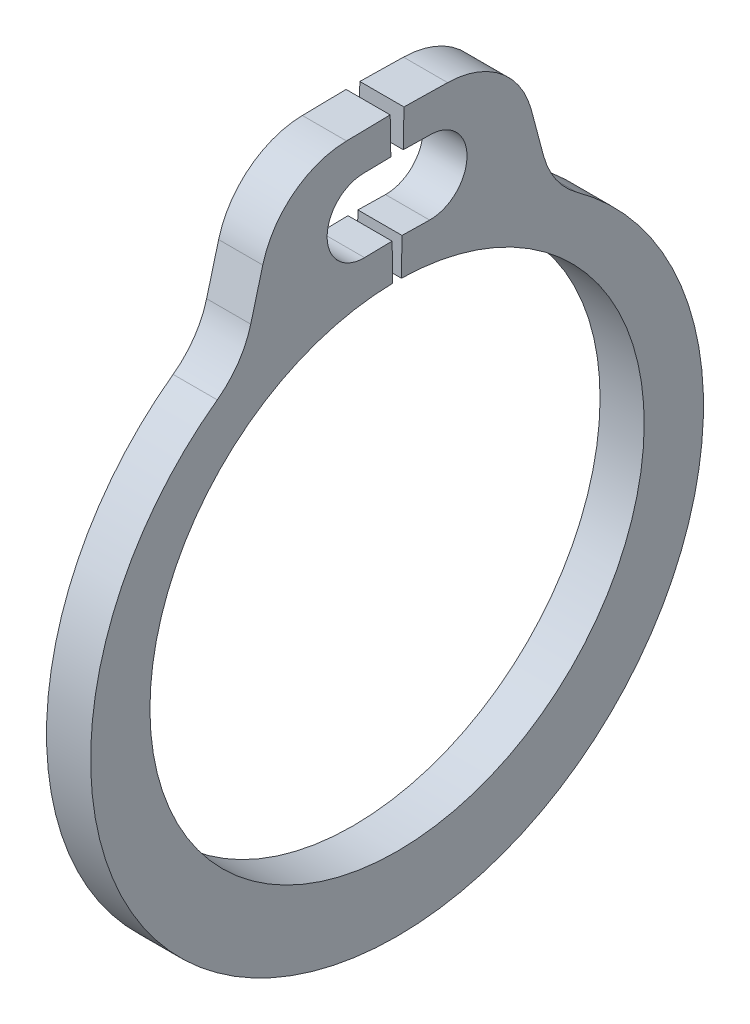
ISO-10303-21;
HEADER;
FILE_DESCRIPTION(('STEP AP214'),'2;1');
FILE_NAME('part.step','',(''),(''),'','','');
FILE_SCHEMA(('AUTOMOTIVE_DESIGN { 1 0 10303 214 1 1 1 1 }'));
ENDSEC;
DATA;
#1=APPLICATION_CONTEXT('core data for automotive mechanical design processes');
#2=APPLICATION_PROTOCOL_DEFINITION('international standard','automotive_design',2000,#1);
#3=PRODUCT_CONTEXT('',#1,'mechanical');
#4=PRODUCT('Part','Part','',(#3));
#5=PRODUCT_RELATED_PRODUCT_CATEGORY('part','',(#4));
#6=PRODUCT_DEFINITION_FORMATION('','',#4);
#7=PRODUCT_DEFINITION_CONTEXT('part definition',#1,'design');
#8=PRODUCT_DEFINITION('design','',#6,#7);
#9=PRODUCT_DEFINITION_SHAPE('','',#8);
#10=(LENGTH_UNIT() NAMED_UNIT(*) SI_UNIT(.MILLI.,.METRE.));
#11=(NAMED_UNIT(*) PLANE_ANGLE_UNIT() SI_UNIT($,.RADIAN.));
#12=(NAMED_UNIT(*) SI_UNIT($,.STERADIAN.) SOLID_ANGLE_UNIT());
#13=UNCERTAINTY_MEASURE_WITH_UNIT(LENGTH_MEASURE(1.E-05),#10,'distance_accuracy_value','');
#14=(GEOMETRIC_REPRESENTATION_CONTEXT(3) GLOBAL_UNCERTAINTY_ASSIGNED_CONTEXT((#13)) GLOBAL_UNIT_ASSIGNED_CONTEXT((#10,
#11,#12)) REPRESENTATION_CONTEXT('',''));
#15=CARTESIAN_POINT('',(0.,0.,0.));
#16=DIRECTION('',(0.,0.,1.));
#17=DIRECTION('',(1.,0.,0.));
#18=AXIS2_PLACEMENT_3D('',#15,#16,#17);
#19=CARTESIAN_POINT('',(0.1905,0.,0.));
#20=DIRECTION('',(-1.,0.,0.));
#21=DIRECTION('',(0.,0.,1.));
#22=AXIS2_PLACEMENT_3D('',#19,#20,#21);
#23=CYLINDRICAL_SURFACE('',#22,2.1336);
#24=CARTESIAN_POINT('',(-0.1905,0.,0.));
#25=DIRECTION('',(-1.,0.,0.));
#26=DIRECTION('',(0.,0.,-1.));
#27=AXIS2_PLACEMENT_3D('',#24,#25,#26);
#28=CIRCLE('',#27,2.1336);
#29=CARTESIAN_POINT('',(-0.1905,2.13327504238568,-0.0372364543745881));
#30=VERTEX_POINT('',#29);
#31=CARTESIAN_POINT('',(-0.1905,2.13327504238568,0.0372364543745881));
#32=VERTEX_POINT('',#31);
#33=EDGE_CURVE('E192',#30,#32,#28,.T.);
#34=ORIENTED_EDGE('',*,*,#33,.T.);
#35=DIRECTION('',(-1.,0.,0.));
#36=VECTOR('',#35,1.);
#37=CARTESIAN_POINT('',(0.1905,2.13327504238568,0.0372364543745881));
#38=LINE('',#37,#36);
#39=CARTESIAN_POINT('',(0.1905,2.13327504238568,0.0372364543745881));
#40=VERTEX_POINT('',#39);
#41=EDGE_CURVE('E174',#40,#32,#38,.T.);
#42=ORIENTED_EDGE('',*,*,#41,.F.);
#43=CARTESIAN_POINT('',(0.1905,0.,0.));
#44=DIRECTION('',(-1.,0.,0.));
#45=DIRECTION('',(0.,0.,-1.));
#46=AXIS2_PLACEMENT_3D('',#43,#44,#45);
#47=CIRCLE('',#46,2.1336);
#48=CARTESIAN_POINT('',(0.1905,2.13327504238568,-0.0372364543745881));
#49=VERTEX_POINT('',#48);
#50=EDGE_CURVE('E180',#49,#40,#47,.T.);
#51=ORIENTED_EDGE('',*,*,#50,.F.);
#52=DIRECTION('',(-1.,0.,0.));
#53=VECTOR('',#52,1.);
#54=CARTESIAN_POINT('',(0.1905,2.13327504238568,-0.0372364543745881));
#55=LINE('',#54,#53);
#56=EDGE_CURVE('E270',#49,#30,#55,.T.);
#57=ORIENTED_EDGE('',*,*,#56,.T.);
#58=EDGE_LOOP('',(#34,#42,#51,#57));
#59=FACE_BOUND('',#58,.T.);
#60=ADVANCED_FACE('F31',(#59),#23,.F.);
#61=CARTESIAN_POINT('',(0.1905,2.45072668559783,0.0427775934184257));
#62=DIRECTION('',(0.,-0.0174524064372838,0.999847695156391));
#63=DIRECTION('',(0.,-0.999847695156391,-0.0174524064372838));
#64=AXIS2_PLACEMENT_3D('',#61,#62,#63);
#65=PLANE('',#64);
#66=DIRECTION('',(0.,0.999847695156391,0.0174524064372838));
#67=VECTOR('',#66,1.);
#68=CARTESIAN_POINT('',(-0.1905,2.45072668559783,0.0427775934184257));
#69=LINE('',#68,#67);
#70=CARTESIAN_POINT('',(-0.1905,2.45072668559783,0.0427775934184257));
#71=VERTEX_POINT('',#70);
#72=EDGE_CURVE('E272',#32,#71,#69,.T.);
#73=ORIENTED_EDGE('',*,*,#72,.T.);
#74=DIRECTION('',(-1.,0.,0.));
#75=VECTOR('',#74,1.);
#76=CARTESIAN_POINT('',(0.1905,2.45072668559783,0.0427775934184257));
#77=LINE('',#76,#75);
#78=CARTESIAN_POINT('',(0.1905,2.45072668559783,0.0427775934184257));
#79=VERTEX_POINT('',#78);
#80=EDGE_CURVE('E177',#79,#71,#77,.T.);
#81=ORIENTED_EDGE('',*,*,#80,.F.);
#82=DIRECTION('',(0.,0.999847695156391,0.0174524064372838));
#83=VECTOR('',#82,1.);
#84=CARTESIAN_POINT('',(0.1905,2.45072668559783,0.0427775934184257));
#85=LINE('',#84,#83);
#86=EDGE_CURVE('E170',#40,#79,#85,.T.);
#87=ORIENTED_EDGE('',*,*,#86,.F.);
#88=ORIENTED_EDGE('',*,*,#41,.T.);
#89=EDGE_LOOP('',(#73,#81,#87,#88));
#90=FACE_BOUND('',#89,.T.);
#91=ADVANCED_FACE('F172',(#90),#65,.F.);
#92=CARTESIAN_POINT('',(0.1905,2.45072668559783,0.0427775934184257));
#93=DIRECTION('',(0.,-0.999847695156391,-0.0174524064372829));
#94=DIRECTION('',(0.,0.0174524064372829,-0.999847695156391));
#95=AXIS2_PLACEMENT_3D('',#92,#93,#94);
#96=PLANE('',#95);
#97=DIRECTION('',(0.,-0.0174524064372829,0.999847695156391));
#98=VECTOR('',#97,1.);
#99=CARTESIAN_POINT('',(-0.1905,2.45072668559783,0.0427775934184257));
#100=LINE('',#99,#98);
#101=CARTESIAN_POINT('',(-0.1905,2.44657083131495,0.280866325827541));
#102=VERTEX_POINT('',#101);
#103=EDGE_CURVE('E274',#71,#102,#100,.T.);
#104=ORIENTED_EDGE('',*,*,#103,.T.);
#105=DIRECTION('',(-1.,0.,0.));
#106=VECTOR('',#105,1.);
#107=CARTESIAN_POINT('',(0.1905,2.44657083131495,0.280866325827541));
#108=LINE('',#107,#106);
#109=CARTESIAN_POINT('',(0.1905,2.44657083131495,0.280866325827541));
#110=VERTEX_POINT('',#109);
#111=EDGE_CURVE('E197',#110,#102,#108,.T.);
#112=ORIENTED_EDGE('',*,*,#111,.F.);
#113=DIRECTION('',(0.,-0.0174524064372829,0.999847695156391));
#114=VECTOR('',#113,1.);
#115=CARTESIAN_POINT('',(0.1905,2.45072668559783,0.0427775934184257));
#116=LINE('',#115,#114);
#117=EDGE_CURVE('E179',#79,#110,#116,.T.);
#118=ORIENTED_EDGE('',*,*,#117,.F.);
#119=ORIENTED_EDGE('',*,*,#80,.T.);
#120=EDGE_LOOP('',(#104,#112,#118,#119));
#121=FACE_BOUND('',#120,.T.);
#122=ADVANCED_FACE('F376',(#121),#96,.F.);
#123=CARTESIAN_POINT('',(0.1905,2.76402247452711,0.286407464871378));
#124=DIRECTION('',(-1.,0.,0.));
#125=DIRECTION('',(0.,0.,1.));
#126=AXIS2_PLACEMENT_3D('',#123,#124,#125);
#127=CYLINDRICAL_SURFACE('',#126,0.3175);
#128=CARTESIAN_POINT('',(-0.1905,2.76402247452711,0.286407464871378));
#129=DIRECTION('',(-1.,0.,0.));
#130=DIRECTION('',(0.,0.,1.));
#131=AXIS2_PLACEMENT_3D('',#128,#129,#130);
#132=CIRCLE('',#131,0.3175);
#133=CARTESIAN_POINT('',(-0.1905,3.08147411773926,0.291948603915216));
#134=VERTEX_POINT('',#133);
#135=EDGE_CURVE('E276',#102,#134,#132,.T.);
#136=ORIENTED_EDGE('',*,*,#135,.T.);
#137=DIRECTION('',(-1.,0.,0.));
#138=VECTOR('',#137,1.);
#139=CARTESIAN_POINT('',(0.1905,3.08147411773926,0.291948603915216));
#140=LINE('',#139,#138);
#141=CARTESIAN_POINT('',(0.1905,3.08147411773926,0.291948603915216));
#142=VERTEX_POINT('',#141);
#143=EDGE_CURVE('E320',#142,#134,#140,.T.);
#144=ORIENTED_EDGE('',*,*,#143,.F.);
#145=CARTESIAN_POINT('',(0.1905,2.76402247452711,0.286407464871378));
#146=DIRECTION('',(-1.,0.,0.));
#147=DIRECTION('',(0.,0.,1.));
#148=AXIS2_PLACEMENT_3D('',#145,#146,#147);
#149=CIRCLE('',#148,0.3175);
#150=EDGE_CURVE('E329',#110,#142,#149,.T.);
#151=ORIENTED_EDGE('',*,*,#150,.F.);
#152=ORIENTED_EDGE('',*,*,#111,.T.);
#153=EDGE_LOOP('',(#136,#144,#151,#152));
#154=FACE_BOUND('',#153,.T.);
#155=ADVANCED_FACE('F327',(#154),#127,.F.);
#156=CARTESIAN_POINT('',(0.1905,3.08562997202214,0.0538598715061008));
#157=DIRECTION('',(0.,0.999847695156391,0.0174524064372829));
#158=DIRECTION('',(0.,-0.0174524064372829,0.999847695156391));
#159=AXIS2_PLACEMENT_3D('',#156,#157,#158);
#160=PLANE('',#159);
#161=DIRECTION('',(0.,0.0174524064372829,-0.999847695156391));
#162=VECTOR('',#161,1.);
#163=CARTESIAN_POINT('',(-0.1905,3.08562997202214,0.0538598715061008));
#164=LINE('',#163,#162);
#165=CARTESIAN_POINT('',(-0.1905,3.08562997202214,0.0538598715061008));
#166=VERTEX_POINT('',#165);
#167=EDGE_CURVE('E278',#134,#166,#164,.T.);
#168=ORIENTED_EDGE('',*,*,#167,.T.);
#169=DIRECTION('',(-1.,0.,0.));
#170=VECTOR('',#169,1.);
#171=CARTESIAN_POINT('',(0.1905,3.08562997202214,0.0538598715061008));
#172=LINE('',#171,#170);
#173=CARTESIAN_POINT('',(0.1905,3.08562997202214,0.0538598715061008));
#174=VERTEX_POINT('',#173);
#175=EDGE_CURVE('E317',#174,#166,#172,.T.);
#176=ORIENTED_EDGE('',*,*,#175,.F.);
#177=DIRECTION('',(0.,0.0174524064372829,-0.999847695156391));
#178=VECTOR('',#177,1.);
#179=CARTESIAN_POINT('',(0.1905,3.08562997202214,0.0538598715061008));
#180=LINE('',#179,#178);
#181=EDGE_CURVE('E345',#142,#174,#180,.T.);
#182=ORIENTED_EDGE('',*,*,#181,.F.);
#183=ORIENTED_EDGE('',*,*,#143,.T.);
#184=EDGE_LOOP('',(#168,#176,#182,#183));
#185=FACE_BOUND('',#184,.T.);
#186=ADVANCED_FACE('F337',(#185),#160,.F.);
#187=CARTESIAN_POINT('',(0.1905,3.08562997202214,0.0538598715061008));
#188=DIRECTION('',(0.,-0.0174524064372832,0.999847695156391));
#189=DIRECTION('',(0.,-0.999847695156391,-0.0174524064372832));
#190=AXIS2_PLACEMENT_3D('',#187,#188,#189);
#191=PLANE('',#190);
#192=DIRECTION('',(0.,0.999847695156391,0.0174524064372832));
#193=VECTOR('',#192,1.);
#194=CARTESIAN_POINT('',(-0.1905,3.08562997202214,0.0538598715061008));
#195=LINE('',#194,#193);
#196=CARTESIAN_POINT('',(-0.1905,3.40308161523429,0.0594010105499382));
#197=VERTEX_POINT('',#196);
#198=EDGE_CURVE('E280',#166,#197,#195,.T.);
#199=ORIENTED_EDGE('',*,*,#198,.T.);
#200=DIRECTION('',(-1.,0.,0.));
#201=VECTOR('',#200,1.);
#202=CARTESIAN_POINT('',(0.1905,3.40308161523429,0.0594010105499382));
#203=LINE('',#202,#201);
#204=CARTESIAN_POINT('',(0.1905,3.40308161523429,0.0594010105499382));
#205=VERTEX_POINT('',#204);
#206=EDGE_CURVE('E314',#205,#197,#203,.T.);
#207=ORIENTED_EDGE('',*,*,#206,.F.);
#208=DIRECTION('',(0.,0.999847695156391,0.0174524064372832));
#209=VECTOR('',#208,1.);
#210=CARTESIAN_POINT('',(0.1905,3.08562997202214,0.0538598715061008));
#211=LINE('',#210,#209);
#212=EDGE_CURVE('E343',#174,#205,#211,.T.);
#213=ORIENTED_EDGE('',*,*,#212,.F.);
#214=ORIENTED_EDGE('',*,*,#175,.T.);
#215=EDGE_LOOP('',(#199,#207,#213,#214));
#216=FACE_BOUND('',#215,.T.);
#217=ADVANCED_FACE('F341',(#216),#191,.F.);
#218=CARTESIAN_POINT('',(0.1905,3.40308161523429,0.0594010105499382));
#219=DIRECTION('',(0.,-0.999847695156391,-0.0174524064372833));
#220=DIRECTION('',(0.,0.0174524064372833,-0.999847695156391));
#221=AXIS2_PLACEMENT_3D('',#218,#219,#220);
#222=PLANE('',#221);
#223=DIRECTION('',(0.,-0.0174524064372833,0.999847695156391));
#224=VECTOR('',#223,1.);
#225=CARTESIAN_POINT('',(-0.1905,3.40308161523429,0.0594010105499382));
#226=LINE('',#225,#224);
#227=CARTESIAN_POINT('',(-0.1905,3.39650096805663,0.436406034863774));
#228=VERTEX_POINT('',#227);
#229=EDGE_CURVE('E282',#197,#228,#226,.T.);
#230=ORIENTED_EDGE('',*,*,#229,.T.);
#231=DIRECTION('',(-1.,0.,0.));
#232=VECTOR('',#231,1.);
#233=CARTESIAN_POINT('',(0.1905,3.39650096805663,0.436406034863774));
#234=LINE('',#233,#232);
#235=CARTESIAN_POINT('',(0.1905,3.39650096805663,0.436406034863774));
#236=VERTEX_POINT('',#235);
#237=EDGE_CURVE('E54',#228,#236,#234,.F.);
#238=ORIENTED_EDGE('',*,*,#237,.T.);
#239=DIRECTION('',(0.,-0.0174524064372833,0.999847695156391));
#240=VECTOR('',#239,1.);
#241=CARTESIAN_POINT('',(0.1905,3.40308161523429,0.0594010105499382));
#242=LINE('',#241,#240);
#243=EDGE_CURVE('E344',#205,#236,#242,.T.);
#244=ORIENTED_EDGE('',*,*,#243,.F.);
#245=ORIENTED_EDGE('',*,*,#206,.T.);
#246=EDGE_LOOP('',(#230,#238,#244,#245));
#247=FACE_BOUND('',#246,.T.);
#248=ADVANCED_FACE('F362',(#247),#222,.F.);
#249=CARTESIAN_POINT('',(0.1905,3.38645819810278,1.0117559401864));
#250=DIRECTION('',(0.,-0.256832135818306,-0.966456027975928));
#251=DIRECTION('',(0.,0.966456027975928,-0.256832135818306));
#252=AXIS2_PLACEMENT_3D('',#249,#250,#251);
#253=PLANE('',#252);
#254=DIRECTION('',(0.,-0.966456027975928,0.256832135818306));
#255=VECTOR('',#254,1.);
#256=CARTESIAN_POINT('',(-0.1905,3.38645819810278,1.0117559401864));
#257=LINE('',#256,#255);
#258=CARTESIAN_POINT('',(-0.1905,2.83032311184101,1.15954679447622));
#259=VERTEX_POINT('',#258);
#260=CARTESIAN_POINT('',(-0.1905,2.44016753972551,1.26322920318104));
#261=VERTEX_POINT('',#260);
#262=EDGE_CURVE('E244',#259,#261,#257,.T.);
#263=ORIENTED_EDGE('',*,*,#262,.T.);
#264=DIRECTION('',(1.,0.,0.));
#265=VECTOR('',#264,1.);
#266=CARTESIAN_POINT('',(0.1905,2.44016753972551,1.26322920318104));
#267=LINE('',#266,#265);
#268=CARTESIAN_POINT('',(0.1905,2.44016753972551,1.26322920318104));
#269=VERTEX_POINT('',#268);
#270=EDGE_CURVE('E206',#261,#269,#267,.T.);
#271=ORIENTED_EDGE('',*,*,#270,.T.);
#272=DIRECTION('',(0.,-0.966456027975928,0.256832135818306));
#273=VECTOR('',#272,1.);
#274=CARTESIAN_POINT('',(0.1905,3.38645819810278,1.0117559401864));
#275=LINE('',#274,#273);
#276=CARTESIAN_POINT('',(0.1905,2.83032311184101,1.15954679447622));
#277=VERTEX_POINT('',#276);
#278=EDGE_CURVE('E258',#277,#269,#275,.T.);
#279=ORIENTED_EDGE('',*,*,#278,.F.);
#280=DIRECTION('',(-1.,0.,0.));
#281=VECTOR('',#280,1.);
#282=CARTESIAN_POINT('',(0.1905,2.83032311184101,1.15954679447622));
#283=LINE('',#282,#281);
#284=EDGE_CURVE('E203',#277,#259,#283,.T.);
#285=ORIENTED_EDGE('',*,*,#284,.T.);
#286=EDGE_LOOP('',(#263,#271,#279,#285));
#287=FACE_BOUND('',#286,.T.);
#288=ADVANCED_FACE('F359',(#287),#253,.F.);
#289=CARTESIAN_POINT('',(0.1905,-0.123136153446836,0.));
#290=DIRECTION('',(-1.,0.,0.));
#291=DIRECTION('',(0.,0.,1.));
#292=AXIS2_PLACEMENT_3D('',#289,#290,#291);
#293=CYLINDRICAL_SURFACE('',#292,2.64546384655316);
#294=CARTESIAN_POINT('',(0.1905,-0.123136153446836,0.));
#295=DIRECTION('',(1.,0.,0.));
#296=DIRECTION('',(0.,0.,-1.));
#297=AXIS2_PLACEMENT_3D('',#294,#295,#296);
#298=CIRCLE('',#297,2.64546384655316);
#299=CARTESIAN_POINT('',(0.1905,2.01888528998576,1.55248932340766));
#300=VERTEX_POINT('',#299);
#301=CARTESIAN_POINT('',(0.1905,2.01888528998577,-1.55248932340766));
#302=VERTEX_POINT('',#301);
#303=EDGE_CURVE('E250',#300,#302,#298,.T.);
#304=ORIENTED_EDGE('',*,*,#303,.F.);
#305=DIRECTION('',(-1.,0.,0.));
#306=VECTOR('',#305,1.);
#307=CARTESIAN_POINT('',(0.1905,2.01888528998576,1.55248932340766));
#308=LINE('',#307,#306);
#309=CARTESIAN_POINT('',(-0.1905,2.01888528998576,1.55248932340766));
#310=VERTEX_POINT('',#309);
#311=EDGE_CURVE('E195',#300,#310,#308,.T.);
#312=ORIENTED_EDGE('',*,*,#311,.T.);
#313=CARTESIAN_POINT('',(-0.1905,-0.123136153446836,0.));
#314=DIRECTION('',(1.,0.,0.));
#315=DIRECTION('',(0.,0.,-1.));
#316=AXIS2_PLACEMENT_3D('',#313,#314,#315);
#317=CIRCLE('',#316,2.64546384655316);
#318=CARTESIAN_POINT('',(-0.1905,2.01888528998577,-1.55248932340766));
#319=VERTEX_POINT('',#318);
#320=EDGE_CURVE('E233',#310,#319,#317,.T.);
#321=ORIENTED_EDGE('',*,*,#320,.T.);
#322=DIRECTION('',(-1.,0.,0.));
#323=VECTOR('',#322,1.);
#324=CARTESIAN_POINT('',(0.1905,2.01888528998577,-1.55248932340766));
#325=LINE('',#324,#323);
#326=EDGE_CURVE('E193',#319,#302,#325,.F.);
#327=ORIENTED_EDGE('',*,*,#326,.T.);
#328=EDGE_LOOP('',(#304,#312,#321,#327));
#329=FACE_BOUND('',#328,.T.);
#330=ADVANCED_FACE('F241',(#329),#293,.T.);
#331=CARTESIAN_POINT('',(0.1905,3.38645819810278,-1.0117559401864));
#332=DIRECTION('',(0.,-0.256832135818306,0.966456027975928));
#333=DIRECTION('',(0.,-0.966456027975928,-0.256832135818306));
#334=AXIS2_PLACEMENT_3D('',#331,#332,#333);
#335=PLANE('',#334);
#336=DIRECTION('',(0.,0.966456027975928,0.256832135818306));
#337=VECTOR('',#336,1.);
#338=CARTESIAN_POINT('',(0.1905,3.38645819810278,-1.0117559401864));
#339=LINE('',#338,#337);
#340=CARTESIAN_POINT('',(0.1905,2.44016753972551,-1.26322920318104));
#341=VERTEX_POINT('',#340);
#342=CARTESIAN_POINT('',(0.1905,2.83032311184101,-1.15954679447622));
#343=VERTEX_POINT('',#342);
#344=EDGE_CURVE('E249',#341,#343,#339,.T.);
#345=ORIENTED_EDGE('',*,*,#344,.F.);
#346=DIRECTION('',(1.,0.,0.));
#347=VECTOR('',#346,1.);
#348=CARTESIAN_POINT('',(-0.1905,2.44016753972551,-1.26322920318104));
#349=LINE('',#348,#347);
#350=CARTESIAN_POINT('',(-0.1905,2.44016753972551,-1.26322920318104));
#351=VERTEX_POINT('',#350);
#352=EDGE_CURVE('E210',#341,#351,#349,.F.);
#353=ORIENTED_EDGE('',*,*,#352,.T.);
#354=DIRECTION('',(0.,0.966456027975928,0.256832135818306));
#355=VECTOR('',#354,1.);
#356=CARTESIAN_POINT('',(-0.1905,3.38645819810278,-1.0117559401864));
#357=LINE('',#356,#355);
#358=CARTESIAN_POINT('',(-0.1905,2.83032311184101,-1.15954679447622));
#359=VERTEX_POINT('',#358);
#360=EDGE_CURVE('E235',#351,#359,#357,.T.);
#361=ORIENTED_EDGE('',*,*,#360,.T.);
#362=DIRECTION('',(-1.,0.,0.));
#363=VECTOR('',#362,1.);
#364=CARTESIAN_POINT('',(0.1905,2.83032311184101,-1.15954679447622));
#365=LINE('',#364,#363);
#366=EDGE_CURVE('E208',#359,#343,#365,.F.);
#367=ORIENTED_EDGE('',*,*,#366,.T.);
#368=EDGE_LOOP('',(#345,#353,#361,#367));
#369=FACE_BOUND('',#368,.T.);
#370=ADVANCED_FACE('F252',(#369),#335,.F.);
#371=CARTESIAN_POINT('',(0.1905,3.40308161523429,-0.0594010105499382));
#372=DIRECTION('',(0.,-0.999847695156391,0.0174524064372829));
#373=DIRECTION('',(0.,-0.0174524064372829,-0.999847695156391));
#374=AXIS2_PLACEMENT_3D('',#371,#372,#373);
#375=PLANE('',#374);
#376=DIRECTION('',(0.,0.0174524064372829,0.999847695156391));
#377=VECTOR('',#376,1.);
#378=CARTESIAN_POINT('',(0.1905,3.40308161523429,-0.0594010105499382));
#379=LINE('',#378,#377);
#380=CARTESIAN_POINT('',(0.1905,3.39650096805663,-0.436406034863773));
#381=VERTEX_POINT('',#380);
#382=CARTESIAN_POINT('',(0.1905,3.40308161523429,-0.0594010105499382));
#383=VERTEX_POINT('',#382);
#384=EDGE_CURVE('E254',#381,#383,#379,.T.);
#385=ORIENTED_EDGE('',*,*,#384,.F.);
#386=DIRECTION('',(-1.,0.,0.));
#387=VECTOR('',#386,1.);
#388=CARTESIAN_POINT('',(0.1905,3.39650096805663,-0.436406034863773));
#389=LINE('',#388,#387);
#390=CARTESIAN_POINT('',(-0.1905,3.39650096805663,-0.436406034863773));
#391=VERTEX_POINT('',#390);
#392=EDGE_CURVE('E221',#381,#391,#389,.T.);
#393=ORIENTED_EDGE('',*,*,#392,.T.);
#394=DIRECTION('',(0.,0.0174524064372829,0.999847695156391));
#395=VECTOR('',#394,1.);
#396=CARTESIAN_POINT('',(-0.1905,3.40308161523429,-0.0594010105499382));
#397=LINE('',#396,#395);
#398=CARTESIAN_POINT('',(-0.1905,3.40308161523429,-0.0594010105499382));
#399=VERTEX_POINT('',#398);
#400=EDGE_CURVE('E287',#391,#399,#397,.T.);
#401=ORIENTED_EDGE('',*,*,#400,.T.);
#402=DIRECTION('',(-1.,0.,0.));
#403=VECTOR('',#402,1.);
#404=CARTESIAN_POINT('',(0.1905,3.40308161523429,-0.0594010105499382));
#405=LINE('',#404,#403);
#406=EDGE_CURVE('E311',#383,#399,#405,.T.);
#407=ORIENTED_EDGE('',*,*,#406,.F.);
#408=EDGE_LOOP('',(#385,#393,#401,#407));
#409=FACE_BOUND('',#408,.T.);
#410=ADVANCED_FACE('F393',(#409),#375,.F.);
#411=CARTESIAN_POINT('',(0.1905,3.08562997202214,-0.0538598715061008));
#412=DIRECTION('',(0.,-0.0174524064372832,-0.999847695156391));
#413=DIRECTION('',(0.,0.999847695156391,-0.0174524064372832));
#414=AXIS2_PLACEMENT_3D('',#411,#412,#413);
#415=PLANE('',#414);
#416=DIRECTION('',(0.,-0.999847695156391,0.0174524064372832));
#417=VECTOR('',#416,1.);
#418=CARTESIAN_POINT('',(-0.1905,3.08562997202214,-0.0538598715061008));
#419=LINE('',#418,#417);
#420=CARTESIAN_POINT('',(-0.1905,3.08562997202214,-0.0538598715061008));
#421=VERTEX_POINT('',#420);
#422=EDGE_CURVE('E289',#399,#421,#419,.T.);
#423=ORIENTED_EDGE('',*,*,#422,.T.);
#424=DIRECTION('',(-1.,0.,0.));
#425=VECTOR('',#424,1.);
#426=CARTESIAN_POINT('',(0.1905,3.08562997202214,-0.0538598715061008));
#427=LINE('',#426,#425);
#428=CARTESIAN_POINT('',(0.1905,3.08562997202214,-0.0538598715061008));
#429=VERTEX_POINT('',#428);
#430=EDGE_CURVE('E308',#429,#421,#427,.T.);
#431=ORIENTED_EDGE('',*,*,#430,.F.);
#432=DIRECTION('',(0.,-0.999847695156391,0.0174524064372832));
#433=VECTOR('',#432,1.);
#434=CARTESIAN_POINT('',(0.1905,3.08562997202214,-0.0538598715061008));
#435=LINE('',#434,#433);
#436=EDGE_CURVE('E256',#383,#429,#435,.T.);
#437=ORIENTED_EDGE('',*,*,#436,.F.);
#438=ORIENTED_EDGE('',*,*,#406,.T.);
#439=EDGE_LOOP('',(#423,#431,#437,#438));
#440=FACE_BOUND('',#439,.T.);
#441=ADVANCED_FACE('F400',(#440),#415,.F.);
#442=CARTESIAN_POINT('',(0.1905,3.08562997202214,-0.0538598715061008));
#443=DIRECTION('',(0.,0.999847695156391,-0.0174524064372829));
#444=DIRECTION('',(0.,0.0174524064372829,0.999847695156391));
#445=AXIS2_PLACEMENT_3D('',#442,#443,#444);
#446=PLANE('',#445);
#447=DIRECTION('',(0.,-0.0174524064372829,-0.999847695156391));
#448=VECTOR('',#447,1.);
#449=CARTESIAN_POINT('',(-0.1905,3.08562997202214,-0.0538598715061008));
#450=LINE('',#449,#448);
#451=CARTESIAN_POINT('',(-0.1905,3.08147411773926,-0.291948603915216));
#452=VERTEX_POINT('',#451);
#453=EDGE_CURVE('E291',#421,#452,#450,.T.);
#454=ORIENTED_EDGE('',*,*,#453,.T.);
#455=DIRECTION('',(-1.,0.,0.));
#456=VECTOR('',#455,1.);
#457=CARTESIAN_POINT('',(0.1905,3.08147411773926,-0.291948603915216));
#458=LINE('',#457,#456);
#459=CARTESIAN_POINT('',(0.1905,3.08147411773926,-0.291948603915216));
#460=VERTEX_POINT('',#459);
#461=EDGE_CURVE('E305',#460,#452,#458,.T.);
#462=ORIENTED_EDGE('',*,*,#461,.F.);
#463=DIRECTION('',(0.,-0.0174524064372829,-0.999847695156391));
#464=VECTOR('',#463,1.);
#465=CARTESIAN_POINT('',(0.1905,3.08562997202214,-0.0538598715061008));
#466=LINE('',#465,#464);
#467=EDGE_CURVE('E263',#429,#460,#466,.T.);
#468=ORIENTED_EDGE('',*,*,#467,.F.);
#469=ORIENTED_EDGE('',*,*,#430,.T.);
#470=EDGE_LOOP('',(#454,#462,#468,#469));
#471=FACE_BOUND('',#470,.T.);
#472=ADVANCED_FACE('F404',(#471),#446,.F.);
#473=CARTESIAN_POINT('',(0.1905,2.76402247452711,-0.286407464871378));
#474=DIRECTION('',(-1.,0.,0.));
#475=DIRECTION('',(0.,0.,1.));
#476=AXIS2_PLACEMENT_3D('',#473,#474,#475);
#477=CYLINDRICAL_SURFACE('',#476,0.3175);
#478=CARTESIAN_POINT('',(-0.1905,2.76402247452711,-0.286407464871378));
#479=DIRECTION('',(-1.,0.,0.));
#480=DIRECTION('',(0.,0.,-1.));
#481=AXIS2_PLACEMENT_3D('',#478,#479,#480);
#482=CIRCLE('',#481,0.3175);
#483=CARTESIAN_POINT('',(-0.1905,2.44657083131495,-0.280866325827541));
#484=VERTEX_POINT('',#483);
#485=EDGE_CURVE('E293',#452,#484,#482,.T.);
#486=ORIENTED_EDGE('',*,*,#485,.T.);
#487=DIRECTION('',(-1.,0.,0.));
#488=VECTOR('',#487,1.);
#489=CARTESIAN_POINT('',(0.1905,2.44657083131495,-0.280866325827541));
#490=LINE('',#489,#488);
#491=CARTESIAN_POINT('',(0.1905,2.44657083131495,-0.280866325827541));
#492=VERTEX_POINT('',#491);
#493=EDGE_CURVE('E302',#492,#484,#490,.T.);
#494=ORIENTED_EDGE('',*,*,#493,.F.);
#495=CARTESIAN_POINT('',(0.1905,2.76402247452711,-0.286407464871378));
#496=DIRECTION('',(-1.,0.,0.));
#497=DIRECTION('',(0.,0.,-1.));
#498=AXIS2_PLACEMENT_3D('',#495,#496,#497);
#499=CIRCLE('',#498,0.3175);
#500=EDGE_CURVE('E265',#460,#492,#499,.T.);
#501=ORIENTED_EDGE('',*,*,#500,.F.);
#502=ORIENTED_EDGE('',*,*,#461,.T.);
#503=EDGE_LOOP('',(#486,#494,#501,#502));
#504=FACE_BOUND('',#503,.T.);
#505=ADVANCED_FACE('F411',(#504),#477,.F.);
#506=CARTESIAN_POINT('',(0.1905,2.45072668559783,-0.0427775934184257));
#507=DIRECTION('',(0.,-0.999847695156391,0.0174524064372829));
#508=DIRECTION('',(0.,-0.0174524064372829,-0.999847695156391));
#509=AXIS2_PLACEMENT_3D('',#506,#507,#508);
#510=PLANE('',#509);
#511=DIRECTION('',(0.,0.0174524064372829,0.999847695156391));
#512=VECTOR('',#511,1.);
#513=CARTESIAN_POINT('',(-0.1905,2.45072668559783,-0.0427775934184257));
#514=LINE('',#513,#512);
#515=CARTESIAN_POINT('',(-0.1905,2.45072668559783,-0.0427775934184257));
#516=VERTEX_POINT('',#515);
#517=EDGE_CURVE('E295',#484,#516,#514,.T.);
#518=ORIENTED_EDGE('',*,*,#517,.T.);
#519=DIRECTION('',(-1.,0.,0.));
#520=VECTOR('',#519,1.);
#521=CARTESIAN_POINT('',(0.1905,2.45072668559783,-0.0427775934184257));
#522=LINE('',#521,#520);
#523=CARTESIAN_POINT('',(0.1905,2.45072668559783,-0.0427775934184257));
#524=VERTEX_POINT('',#523);
#525=EDGE_CURVE('E299',#524,#516,#522,.T.);
#526=ORIENTED_EDGE('',*,*,#525,.F.);
#527=DIRECTION('',(0.,0.0174524064372829,0.999847695156391));
#528=VECTOR('',#527,1.);
#529=CARTESIAN_POINT('',(0.1905,2.45072668559783,-0.0427775934184257));
#530=LINE('',#529,#528);
#531=EDGE_CURVE('E267',#492,#524,#530,.T.);
#532=ORIENTED_EDGE('',*,*,#531,.F.);
#533=ORIENTED_EDGE('',*,*,#493,.T.);
#534=EDGE_LOOP('',(#518,#526,#532,#533));
#535=FACE_BOUND('',#534,.T.);
#536=ADVANCED_FACE('F414',(#535),#510,.F.);
#537=CARTESIAN_POINT('',(0.1905,2.45072668559783,-0.0427775934184257));
#538=DIRECTION('',(0.,-0.0174524064372838,-0.999847695156391));
#539=DIRECTION('',(0.,0.999847695156391,-0.0174524064372838));
#540=AXIS2_PLACEMENT_3D('',#537,#538,#539);
#541=PLANE('',#540);
#542=DIRECTION('',(0.,-0.999847695156391,0.0174524064372838));
#543=VECTOR('',#542,1.);
#544=CARTESIAN_POINT('',(-0.1905,2.45072668559783,-0.0427775934184257));
#545=LINE('',#544,#543);
#546=EDGE_CURVE('E189',#516,#30,#545,.T.);
#547=ORIENTED_EDGE('',*,*,#546,.T.);
#548=ORIENTED_EDGE('',*,*,#56,.F.);
#549=DIRECTION('',(0.,-0.999847695156391,0.0174524064372838));
#550=VECTOR('',#549,1.);
#551=CARTESIAN_POINT('',(0.1905,2.45072668559783,-0.0427775934184257));
#552=LINE('',#551,#550);
#553=EDGE_CURVE('E185',#524,#49,#552,.T.);
#554=ORIENTED_EDGE('',*,*,#553,.F.);
#555=ORIENTED_EDGE('',*,*,#525,.T.);
#556=EDGE_LOOP('',(#547,#548,#554,#555));
#557=FACE_BOUND('',#556,.T.);
#558=ADVANCED_FACE('F417',(#557),#541,.F.);
#559=CARTESIAN_POINT('',(0.1905,0.,0.));
#560=DIRECTION('',(1.,0.,0.));
#561=DIRECTION('',(0.,0.,-1.));
#562=AXIS2_PLACEMENT_3D('',#559,#560,#561);
#563=PLANE('',#562);
#564=ORIENTED_EDGE('',*,*,#243,.T.);
#565=CARTESIAN_POINT('',(0.1905,2.63461702434746,0.423107301158564));
#566=DIRECTION('',(1.,0.,0.));
#567=DIRECTION('',(0.,0.,-1.));
#568=AXIS2_PLACEMENT_3D('',#565,#566,#567);
#569=CIRCLE('',#568,0.762);
#570=EDGE_CURVE('E219',#236,#277,#569,.T.);
#571=ORIENTED_EDGE('',*,*,#570,.T.);
#572=ORIENTED_EDGE('',*,*,#278,.T.);
#573=CARTESIAN_POINT('',(0.1905,2.63587362721906,1.9996686964987));
#574=DIRECTION('',(1.,0.,0.));
#575=DIRECTION('',(0.,0.,-1.));
#576=AXIS2_PLACEMENT_3D('',#573,#574,#575);
#577=CIRCLE('',#576,0.762);
#578=EDGE_CURVE('E226',#269,#300,#577,.F.);
#579=ORIENTED_EDGE('',*,*,#578,.T.);
#580=ORIENTED_EDGE('',*,*,#303,.T.);
#581=CARTESIAN_POINT('',(0.1905,2.63587362721906,-1.9996686964987));
#582=DIRECTION('',(1.,0.,0.));
#583=DIRECTION('',(0.,0.,-1.));
#584=AXIS2_PLACEMENT_3D('',#581,#582,#583);
#585=CIRCLE('',#584,0.762);
#586=EDGE_CURVE('E11',#302,#341,#585,.F.);
#587=ORIENTED_EDGE('',*,*,#586,.T.);
#588=ORIENTED_EDGE('',*,*,#344,.T.);
#589=CARTESIAN_POINT('',(0.1905,2.63461702434746,-0.423107301158564));
#590=DIRECTION('',(1.,0.,0.));
#591=DIRECTION('',(0.,0.,-1.));
#592=AXIS2_PLACEMENT_3D('',#589,#590,#591);
#593=CIRCLE('',#592,0.762);
#594=EDGE_CURVE('E46',#343,#381,#593,.T.);
#595=ORIENTED_EDGE('',*,*,#594,.T.);
#596=ORIENTED_EDGE('',*,*,#384,.T.);
#597=ORIENTED_EDGE('',*,*,#436,.T.);
#598=ORIENTED_EDGE('',*,*,#467,.T.);
#599=ORIENTED_EDGE('',*,*,#500,.T.);
#600=ORIENTED_EDGE('',*,*,#531,.T.);
#601=ORIENTED_EDGE('',*,*,#553,.T.);
#602=ORIENTED_EDGE('',*,*,#50,.T.);
#603=ORIENTED_EDGE('',*,*,#86,.T.);
#604=ORIENTED_EDGE('',*,*,#117,.T.);
#605=ORIENTED_EDGE('',*,*,#150,.T.);
#606=ORIENTED_EDGE('',*,*,#181,.T.);
#607=ORIENTED_EDGE('',*,*,#212,.T.);
#608=EDGE_LOOP('',(#564,#571,#572,#579,#580,#587,#588,#595,#596,#597,#598,#599,#600,#601,#602,
#603,#604,#605,#606,#607));
#609=FACE_BOUND('',#608,.T.);
#610=ADVANCED_FACE('F183',(#609),#563,.T.);
#611=CARTESIAN_POINT('',(-0.1905,0.,0.));
#612=DIRECTION('',(1.,0.,0.));
#613=DIRECTION('',(0.,0.,-1.));
#614=AXIS2_PLACEMENT_3D('',#611,#612,#613);
#615=PLANE('',#614);
#616=ORIENTED_EDGE('',*,*,#262,.F.);
#617=CARTESIAN_POINT('',(-0.1905,2.63461702434746,0.423107301158564));
#618=DIRECTION('',(1.,0.,0.));
#619=DIRECTION('',(0.,0.,-1.));
#620=AXIS2_PLACEMENT_3D('',#617,#618,#619);
#621=CIRCLE('',#620,0.762);
#622=EDGE_CURVE('E215',#259,#228,#621,.F.);
#623=ORIENTED_EDGE('',*,*,#622,.T.);
#624=ORIENTED_EDGE('',*,*,#229,.F.);
#625=ORIENTED_EDGE('',*,*,#198,.F.);
#626=ORIENTED_EDGE('',*,*,#167,.F.);
#627=ORIENTED_EDGE('',*,*,#135,.F.);
#628=ORIENTED_EDGE('',*,*,#103,.F.);
#629=ORIENTED_EDGE('',*,*,#72,.F.);
#630=ORIENTED_EDGE('',*,*,#33,.F.);
#631=ORIENTED_EDGE('',*,*,#546,.F.);
#632=ORIENTED_EDGE('',*,*,#517,.F.);
#633=ORIENTED_EDGE('',*,*,#485,.F.);
#634=ORIENTED_EDGE('',*,*,#453,.F.);
#635=ORIENTED_EDGE('',*,*,#422,.F.);
#636=ORIENTED_EDGE('',*,*,#400,.F.);
#637=CARTESIAN_POINT('',(-0.1905,2.63461702434746,-0.423107301158564));
#638=DIRECTION('',(1.,0.,0.));
#639=DIRECTION('',(0.,0.,-1.));
#640=AXIS2_PLACEMENT_3D('',#637,#638,#639);
#641=CIRCLE('',#640,0.762);
#642=EDGE_CURVE('E213',#391,#359,#641,.F.);
#643=ORIENTED_EDGE('',*,*,#642,.T.);
#644=ORIENTED_EDGE('',*,*,#360,.F.);
#645=CARTESIAN_POINT('',(-0.1905,2.63587362721906,-1.9996686964987));
#646=DIRECTION('',(1.,0.,0.));
#647=DIRECTION('',(0.,0.,-1.));
#648=AXIS2_PLACEMENT_3D('',#645,#646,#647);
#649=CIRCLE('',#648,0.762);
#650=EDGE_CURVE('E39',#351,#319,#649,.T.);
#651=ORIENTED_EDGE('',*,*,#650,.T.);
#652=ORIENTED_EDGE('',*,*,#320,.F.);
#653=CARTESIAN_POINT('',(-0.1905,2.63587362721906,1.9996686964987));
#654=DIRECTION('',(1.,0.,0.));
#655=DIRECTION('',(0.,0.,-1.));
#656=AXIS2_PLACEMENT_3D('',#653,#654,#655);
#657=CIRCLE('',#656,0.762);
#658=EDGE_CURVE('E224',#310,#261,#657,.T.);
#659=ORIENTED_EDGE('',*,*,#658,.T.);
#660=EDGE_LOOP('',(#616,#623,#624,#625,#626,#627,#628,#629,#630,#631,#632,#633,#634,#635,#636,
#643,#644,#651,#652,#659));
#661=FACE_BOUND('',#660,.T.);
#662=ADVANCED_FACE('F232',(#661),#615,.F.);
#663=CARTESIAN_POINT('',(0.1905,2.63587362721906,1.9996686964987));
#664=DIRECTION('',(-1.,0.,0.));
#665=DIRECTION('',(0.,0.,1.));
#666=AXIS2_PLACEMENT_3D('',#663,#664,#665);
#667=CYLINDRICAL_SURFACE('',#666,0.762);
#668=ORIENTED_EDGE('',*,*,#578,.F.);
#669=ORIENTED_EDGE('',*,*,#270,.F.);
#670=ORIENTED_EDGE('',*,*,#658,.F.);
#671=ORIENTED_EDGE('',*,*,#311,.F.);
#672=EDGE_LOOP('',(#668,#669,#670,#671));
#673=FACE_BOUND('',#672,.T.);
#674=ADVANCED_FACE('F358',(#673),#667,.F.);
#675=CARTESIAN_POINT('',(0.1905,2.63587362721906,-1.9996686964987));
#676=DIRECTION('',(-1.,0.,0.));
#677=DIRECTION('',(0.,0.,1.));
#678=AXIS2_PLACEMENT_3D('',#675,#676,#677);
#679=CYLINDRICAL_SURFACE('',#678,0.762);
#680=ORIENTED_EDGE('',*,*,#586,.F.);
#681=ORIENTED_EDGE('',*,*,#326,.F.);
#682=ORIENTED_EDGE('',*,*,#650,.F.);
#683=ORIENTED_EDGE('',*,*,#352,.F.);
#684=EDGE_LOOP('',(#680,#681,#682,#683));
#685=FACE_BOUND('',#684,.T.);
#686=ADVANCED_FACE('F247',(#685),#679,.F.);
#687=CARTESIAN_POINT('',(0.1905,2.63461702434746,0.423107301158564));
#688=DIRECTION('',(-1.,0.,0.));
#689=DIRECTION('',(0.,0.,1.));
#690=AXIS2_PLACEMENT_3D('',#687,#688,#689);
#691=CYLINDRICAL_SURFACE('',#690,0.762);
#692=ORIENTED_EDGE('',*,*,#570,.F.);
#693=ORIENTED_EDGE('',*,*,#237,.F.);
#694=ORIENTED_EDGE('',*,*,#622,.F.);
#695=ORIENTED_EDGE('',*,*,#284,.F.);
#696=EDGE_LOOP('',(#692,#693,#694,#695));
#697=FACE_BOUND('',#696,.T.);
#698=ADVANCED_FACE('F361',(#697),#691,.T.);
#699=CARTESIAN_POINT('',(0.1905,2.63461702434746,-0.423107301158564));
#700=DIRECTION('',(-1.,0.,0.));
#701=DIRECTION('',(0.,0.,1.));
#702=AXIS2_PLACEMENT_3D('',#699,#700,#701);
#703=CYLINDRICAL_SURFACE('',#702,0.762);
#704=ORIENTED_EDGE('',*,*,#594,.F.);
#705=ORIENTED_EDGE('',*,*,#366,.F.);
#706=ORIENTED_EDGE('',*,*,#642,.F.);
#707=ORIENTED_EDGE('',*,*,#392,.F.);
#708=EDGE_LOOP('',(#704,#705,#706,#707));
#709=FACE_BOUND('',#708,.T.);
#710=ADVANCED_FACE('F33',(#709),#703,.T.);
#711=CLOSED_SHELL('',(#60,#91,#122,#155,#186,#217,#248,#288,#330,#370,#410,#441,#472,#505,#536,
#558,#610,#662,#674,#686,#698,#710));
#712=MANIFOLD_SOLID_BREP('B2',#711);
#713=ADVANCED_BREP_SHAPE_REPRESENTATION('',(#18,#712),#14);
#714=SHAPE_DEFINITION_REPRESENTATION(#9,#713);
ENDSEC;
END-ISO-10303-21;
